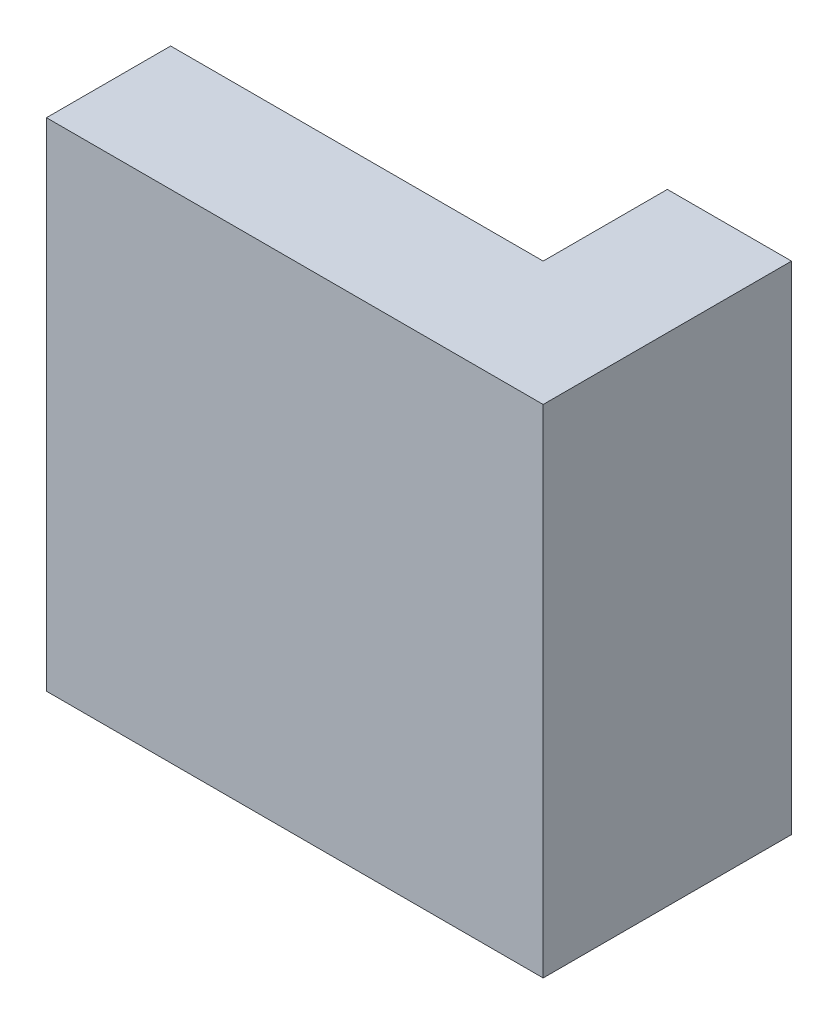
ISO-10303-21;
HEADER;
FILE_DESCRIPTION(('STEP AP214'),'2;1');
FILE_NAME('part.step','',(''),(''),'','','');
FILE_SCHEMA(('AUTOMOTIVE_DESIGN { 1 0 10303 214 1 1 1 1 }'));
ENDSEC;
DATA;
#1=APPLICATION_CONTEXT('core data for automotive mechanical design processes');
#2=APPLICATION_PROTOCOL_DEFINITION('international standard','automotive_design',2000,#1);
#3=PRODUCT_CONTEXT('',#1,'mechanical');
#4=PRODUCT('Part','Part','',(#3));
#5=PRODUCT_RELATED_PRODUCT_CATEGORY('part','',(#4));
#6=PRODUCT_DEFINITION_FORMATION('','',#4);
#7=PRODUCT_DEFINITION_CONTEXT('part definition',#1,'design');
#8=PRODUCT_DEFINITION('design','',#6,#7);
#9=PRODUCT_DEFINITION_SHAPE('','',#8);
#10=(LENGTH_UNIT() NAMED_UNIT(*) SI_UNIT(.MILLI.,.METRE.));
#11=(NAMED_UNIT(*) PLANE_ANGLE_UNIT() SI_UNIT($,.RADIAN.));
#12=(NAMED_UNIT(*) SI_UNIT($,.STERADIAN.) SOLID_ANGLE_UNIT());
#13=UNCERTAINTY_MEASURE_WITH_UNIT(LENGTH_MEASURE(1.E-05),#10,'distance_accuracy_value','');
#14=(GEOMETRIC_REPRESENTATION_CONTEXT(3) GLOBAL_UNCERTAINTY_ASSIGNED_CONTEXT((#13)) GLOBAL_UNIT_ASSIGNED_CONTEXT((#10,
#11,#12)) REPRESENTATION_CONTEXT('',''));
#15=CARTESIAN_POINT('',(0.,0.,0.));
#16=DIRECTION('',(0.,0.,1.));
#17=DIRECTION('',(1.,0.,0.));
#18=AXIS2_PLACEMENT_3D('',#15,#16,#17);
#19=CARTESIAN_POINT('',(0.,12.7,-3.175));
#20=DIRECTION('',(0.,0.,1.));
#21=DIRECTION('',(1.,0.,0.));
#22=AXIS2_PLACEMENT_3D('',#19,#20,#21);
#23=PLANE('',#22);
#24=DIRECTION('',(0.,1.,0.));
#25=VECTOR('',#24,1.);
#26=CARTESIAN_POINT('',(9.525,12.7,-3.175));
#27=LINE('',#26,#25);
#28=CARTESIAN_POINT('',(9.525,0.,-3.175));
#29=VERTEX_POINT('',#28);
#30=CARTESIAN_POINT('',(9.525,12.7,-3.175));
#31=VERTEX_POINT('',#30);
#32=EDGE_CURVE('E56',#29,#31,#27,.T.);
#33=ORIENTED_EDGE('',*,*,#32,.F.);
#34=DIRECTION('',(-1.,0.,0.));
#35=VECTOR('',#34,1.);
#36=CARTESIAN_POINT('',(0.,0.,-3.175));
#37=LINE('',#36,#35);
#38=CARTESIAN_POINT('',(0.,0.,-3.175));
#39=VERTEX_POINT('',#38);
#40=EDGE_CURVE('E78',#29,#39,#37,.T.);
#41=ORIENTED_EDGE('',*,*,#40,.T.);
#42=DIRECTION('',(0.,-1.,0.));
#43=VECTOR('',#42,1.);
#44=CARTESIAN_POINT('',(0.,12.7,-3.175));
#45=LINE('',#44,#43);
#46=CARTESIAN_POINT('',(0.,12.7,-3.175));
#47=VERTEX_POINT('',#46);
#48=EDGE_CURVE('E139',#47,#39,#45,.T.);
#49=ORIENTED_EDGE('',*,*,#48,.F.);
#50=DIRECTION('',(-1.,0.,0.));
#51=VECTOR('',#50,1.);
#52=CARTESIAN_POINT('',(0.,12.7,-3.175));
#53=LINE('',#52,#51);
#54=EDGE_CURVE('E64',#31,#47,#53,.T.);
#55=ORIENTED_EDGE('',*,*,#54,.F.);
#56=EDGE_LOOP('',(#33,#41,#49,#55));
#57=FACE_BOUND('',#56,.T.);
#58=ADVANCED_FACE('F41',(#57),#23,.F.);
#59=CARTESIAN_POINT('',(0.,12.7,0.));
#60=DIRECTION('',(1.,0.,0.));
#61=DIRECTION('',(0.,0.,-1.));
#62=AXIS2_PLACEMENT_3D('',#59,#60,#61);
#63=PLANE('',#62);
#64=DIRECTION('',(0.,0.,1.));
#65=VECTOR('',#64,1.);
#66=CARTESIAN_POINT('',(0.,0.,0.));
#67=LINE('',#66,#65);
#68=CARTESIAN_POINT('',(0.,0.,0.));
#69=VERTEX_POINT('',#68);
#70=EDGE_CURVE('E132',#39,#69,#67,.T.);
#71=ORIENTED_EDGE('',*,*,#70,.T.);
#72=DIRECTION('',(0.,-1.,0.));
#73=VECTOR('',#72,1.);
#74=CARTESIAN_POINT('',(0.,12.7,0.));
#75=LINE('',#74,#73);
#76=CARTESIAN_POINT('',(0.,12.7,0.));
#77=VERTEX_POINT('',#76);
#78=EDGE_CURVE('E11',#77,#69,#75,.T.);
#79=ORIENTED_EDGE('',*,*,#78,.F.);
#80=DIRECTION('',(0.,0.,1.));
#81=VECTOR('',#80,1.);
#82=CARTESIAN_POINT('',(0.,12.7,0.));
#83=LINE('',#82,#81);
#84=EDGE_CURVE('E133',#47,#77,#83,.T.);
#85=ORIENTED_EDGE('',*,*,#84,.F.);
#86=ORIENTED_EDGE('',*,*,#48,.T.);
#87=EDGE_LOOP('',(#71,#79,#85,#86));
#88=FACE_BOUND('',#87,.T.);
#89=ADVANCED_FACE('F43',(#88),#63,.F.);
#90=CARTESIAN_POINT('',(0.,12.7,0.));
#91=DIRECTION('',(0.,0.,-1.));
#92=DIRECTION('',(-1.,0.,0.));
#93=AXIS2_PLACEMENT_3D('',#90,#91,#92);
#94=PLANE('',#93);
#95=DIRECTION('',(1.,0.,0.));
#96=VECTOR('',#95,1.);
#97=CARTESIAN_POINT('',(0.,0.,0.));
#98=LINE('',#97,#96);
#99=CARTESIAN_POINT('',(12.7,0.,0.));
#100=VERTEX_POINT('',#99);
#101=EDGE_CURVE('E108',#69,#100,#98,.T.);
#102=ORIENTED_EDGE('',*,*,#101,.T.);
#103=DIRECTION('',(0.,-1.,0.));
#104=VECTOR('',#103,1.);
#105=CARTESIAN_POINT('',(12.7,12.7,0.));
#106=LINE('',#105,#104);
#107=CARTESIAN_POINT('',(12.7,12.7,0.));
#108=VERTEX_POINT('',#107);
#109=EDGE_CURVE('E49',#108,#100,#106,.T.);
#110=ORIENTED_EDGE('',*,*,#109,.F.);
#111=DIRECTION('',(1.,0.,0.));
#112=VECTOR('',#111,1.);
#113=CARTESIAN_POINT('',(0.,12.7,0.));
#114=LINE('',#113,#112);
#115=EDGE_CURVE('E83',#77,#108,#114,.T.);
#116=ORIENTED_EDGE('',*,*,#115,.F.);
#117=ORIENTED_EDGE('',*,*,#78,.T.);
#118=EDGE_LOOP('',(#102,#110,#116,#117));
#119=FACE_BOUND('',#118,.T.);
#120=ADVANCED_FACE('F147',(#119),#94,.F.);
#121=CARTESIAN_POINT('',(12.7,12.7,0.));
#122=DIRECTION('',(-1.,0.,0.));
#123=DIRECTION('',(0.,0.,1.));
#124=AXIS2_PLACEMENT_3D('',#121,#122,#123);
#125=PLANE('',#124);
#126=DIRECTION('',(0.,0.,-1.));
#127=VECTOR('',#126,1.);
#128=CARTESIAN_POINT('',(12.7,0.,0.));
#129=LINE('',#128,#127);
#130=CARTESIAN_POINT('',(12.7,0.,-6.35));
#131=VERTEX_POINT('',#130);
#132=EDGE_CURVE('E101',#100,#131,#129,.T.);
#133=ORIENTED_EDGE('',*,*,#132,.T.);
#134=DIRECTION('',(0.,-1.,0.));
#135=VECTOR('',#134,1.);
#136=CARTESIAN_POINT('',(12.7,12.7,-6.35));
#137=LINE('',#136,#135);
#138=CARTESIAN_POINT('',(12.7,12.7,-6.35));
#139=VERTEX_POINT('',#138);
#140=EDGE_CURVE('E106',#139,#131,#137,.T.);
#141=ORIENTED_EDGE('',*,*,#140,.F.);
#142=DIRECTION('',(0.,0.,-1.));
#143=VECTOR('',#142,1.);
#144=CARTESIAN_POINT('',(12.7,12.7,0.));
#145=LINE('',#144,#143);
#146=EDGE_CURVE('E136',#108,#139,#145,.T.);
#147=ORIENTED_EDGE('',*,*,#146,.F.);
#148=ORIENTED_EDGE('',*,*,#109,.T.);
#149=EDGE_LOOP('',(#133,#141,#147,#148));
#150=FACE_BOUND('',#149,.T.);
#151=ADVANCED_FACE('F103',(#150),#125,.F.);
#152=CARTESIAN_POINT('',(0.,12.7,0.));
#153=DIRECTION('',(0.,-1.,0.));
#154=DIRECTION('',(0.,0.,-1.));
#155=AXIS2_PLACEMENT_3D('',#152,#153,#154);
#156=PLANE('',#155);
#157=ORIENTED_EDGE('',*,*,#84,.T.);
#158=ORIENTED_EDGE('',*,*,#115,.T.);
#159=ORIENTED_EDGE('',*,*,#146,.T.);
#160=DIRECTION('',(1.,0.,0.));
#161=VECTOR('',#160,1.);
#162=CARTESIAN_POINT('',(12.7,12.7,-6.35));
#163=LINE('',#162,#161);
#164=CARTESIAN_POINT('',(9.525,12.7,-6.35));
#165=VERTEX_POINT('',#164);
#166=EDGE_CURVE('E123',#165,#139,#163,.T.);
#167=ORIENTED_EDGE('',*,*,#166,.F.);
#168=DIRECTION('',(0.,0.,1.));
#169=VECTOR('',#168,1.);
#170=CARTESIAN_POINT('',(9.525,12.7,-6.35));
#171=LINE('',#170,#169);
#172=EDGE_CURVE('E128',#165,#31,#171,.T.);
#173=ORIENTED_EDGE('',*,*,#172,.T.);
#174=ORIENTED_EDGE('',*,*,#54,.T.);
#175=EDGE_LOOP('',(#157,#158,#159,#167,#173,#174));
#176=FACE_BOUND('',#175,.T.);
#177=ADVANCED_FACE('F153',(#176),#156,.F.);
#178=CARTESIAN_POINT('',(0.,0.,0.));
#179=DIRECTION('',(0.,-1.,0.));
#180=DIRECTION('',(0.,0.,-1.));
#181=AXIS2_PLACEMENT_3D('',#178,#179,#180);
#182=PLANE('',#181);
#183=ORIENTED_EDGE('',*,*,#70,.F.);
#184=ORIENTED_EDGE('',*,*,#40,.F.);
#185=DIRECTION('',(0.,0.,1.));
#186=VECTOR('',#185,1.);
#187=CARTESIAN_POINT('',(9.525,0.,-6.35));
#188=LINE('',#187,#186);
#189=CARTESIAN_POINT('',(9.525,0.,-6.35));
#190=VERTEX_POINT('',#189);
#191=EDGE_CURVE('E115',#190,#29,#188,.T.);
#192=ORIENTED_EDGE('',*,*,#191,.F.);
#193=DIRECTION('',(-1.,0.,0.));
#194=VECTOR('',#193,1.);
#195=CARTESIAN_POINT('',(12.7,0.,-6.35));
#196=LINE('',#195,#194);
#197=EDGE_CURVE('E111',#131,#190,#196,.T.);
#198=ORIENTED_EDGE('',*,*,#197,.F.);
#199=ORIENTED_EDGE('',*,*,#132,.F.);
#200=ORIENTED_EDGE('',*,*,#101,.F.);
#201=EDGE_LOOP('',(#183,#184,#192,#198,#199,#200));
#202=FACE_BOUND('',#201,.T.);
#203=ADVANCED_FACE('F113',(#202),#182,.T.);
#204=CARTESIAN_POINT('',(9.525,12.7,-6.35));
#205=DIRECTION('',(1.,0.,0.));
#206=DIRECTION('',(0.,1.,0.));
#207=AXIS2_PLACEMENT_3D('',#204,#205,#206);
#208=PLANE('',#207);
#209=ORIENTED_EDGE('',*,*,#32,.T.);
#210=ORIENTED_EDGE('',*,*,#172,.F.);
#211=DIRECTION('',(0.,1.,0.));
#212=VECTOR('',#211,1.);
#213=CARTESIAN_POINT('',(9.525,12.7,-6.35));
#214=LINE('',#213,#212);
#215=EDGE_CURVE('E118',#190,#165,#214,.T.);
#216=ORIENTED_EDGE('',*,*,#215,.F.);
#217=ORIENTED_EDGE('',*,*,#191,.T.);
#218=EDGE_LOOP('',(#209,#210,#216,#217));
#219=FACE_BOUND('',#218,.T.);
#220=ADVANCED_FACE('F162',(#219),#208,.F.);
#221=CARTESIAN_POINT('',(0.,0.,-6.35));
#222=DIRECTION('',(0.,0.,-1.));
#223=DIRECTION('',(-1.,0.,0.));
#224=AXIS2_PLACEMENT_3D('',#221,#222,#223);
#225=PLANE('',#224);
#226=ORIENTED_EDGE('',*,*,#140,.T.);
#227=ORIENTED_EDGE('',*,*,#197,.T.);
#228=ORIENTED_EDGE('',*,*,#215,.T.);
#229=ORIENTED_EDGE('',*,*,#166,.T.);
#230=EDGE_LOOP('',(#226,#227,#228,#229));
#231=FACE_BOUND('',#230,.T.);
#232=ADVANCED_FACE('F121',(#231),#225,.T.);
#233=CLOSED_SHELL('',(#58,#89,#120,#151,#177,#203,#220,#232));
#234=MANIFOLD_SOLID_BREP('B2',#233);
#235=ADVANCED_BREP_SHAPE_REPRESENTATION('',(#18,#234),#14);
#236=SHAPE_DEFINITION_REPRESENTATION(#9,#235);
ENDSEC;
END-ISO-10303-21;
